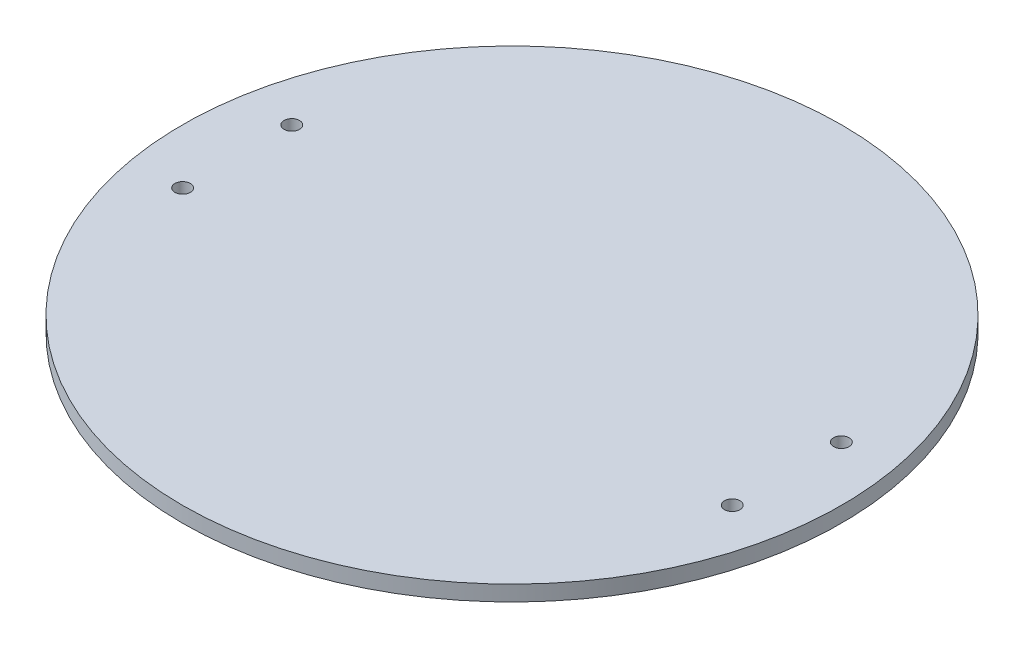
ISO-10303-21;
HEADER;
FILE_DESCRIPTION(('STEP AP214'),'2;1');
FILE_NAME('part.step','',(''),(''),'','','');
FILE_SCHEMA(('AUTOMOTIVE_DESIGN { 1 0 10303 214 1 1 1 1 }'));
ENDSEC;
DATA;
#1=APPLICATION_CONTEXT('core data for automotive mechanical design processes');
#2=APPLICATION_PROTOCOL_DEFINITION('international standard','automotive_design',2000,#1);
#3=PRODUCT_CONTEXT('',#1,'mechanical');
#4=PRODUCT('Part','Part','',(#3));
#5=PRODUCT_RELATED_PRODUCT_CATEGORY('part','',(#4));
#6=PRODUCT_DEFINITION_FORMATION('','',#4);
#7=PRODUCT_DEFINITION_CONTEXT('part definition',#1,'design');
#8=PRODUCT_DEFINITION('design','',#6,#7);
#9=PRODUCT_DEFINITION_SHAPE('','',#8);
#10=(LENGTH_UNIT() NAMED_UNIT(*) SI_UNIT(.MILLI.,.METRE.));
#11=(NAMED_UNIT(*) PLANE_ANGLE_UNIT() SI_UNIT($,.RADIAN.));
#12=(NAMED_UNIT(*) SI_UNIT($,.STERADIAN.) SOLID_ANGLE_UNIT());
#13=UNCERTAINTY_MEASURE_WITH_UNIT(LENGTH_MEASURE(1.E-05),#10,'distance_accuracy_value','');
#14=(GEOMETRIC_REPRESENTATION_CONTEXT(3) GLOBAL_UNCERTAINTY_ASSIGNED_CONTEXT((#13)) GLOBAL_UNIT_ASSIGNED_CONTEXT((#10,
#11,#12)) REPRESENTATION_CONTEXT('',''));
#15=CARTESIAN_POINT('',(0.,0.,0.));
#16=DIRECTION('',(0.,0.,1.));
#17=DIRECTION('',(1.,0.,0.));
#18=AXIS2_PLACEMENT_3D('',#15,#16,#17);
#19=CARTESIAN_POINT('',(0.,2.,0.));
#20=DIRECTION('',(0.,-1.,0.));
#21=DIRECTION('',(0.,0.,-1.));
#22=AXIS2_PLACEMENT_3D('',#19,#20,#21);
#23=CYLINDRICAL_SURFACE('',#22,85.);
#24=CARTESIAN_POINT('',(0.,2.,0.));
#25=DIRECTION('',(0.,1.,0.));
#26=DIRECTION('',(0.,0.,1.));
#27=AXIS2_PLACEMENT_3D('',#24,#25,#26);
#28=CIRCLE('',#27,85.);
#29=CARTESIAN_POINT('',(0.,2.,85.));
#30=VERTEX_POINT('',#29);
#31=EDGE_CURVE('E10',#30,#30,#28,.T.);
#32=ORIENTED_EDGE('',*,*,#31,.F.);
#33=EDGE_LOOP('',(#32));
#34=FACE_BOUND('',#33,.T.);
#35=CARTESIAN_POINT('',(0.,-2.,0.));
#36=DIRECTION('',(0.,1.,0.));
#37=DIRECTION('',(0.,0.,1.));
#38=AXIS2_PLACEMENT_3D('',#35,#36,#37);
#39=CIRCLE('',#38,85.);
#40=CARTESIAN_POINT('',(0.,-2.,85.));
#41=VERTEX_POINT('',#40);
#42=EDGE_CURVE('E39',#41,#41,#39,.T.);
#43=ORIENTED_EDGE('',*,*,#42,.T.);
#44=EDGE_LOOP('',(#43));
#45=FACE_BOUND('',#44,.T.);
#46=ADVANCED_FACE('F36',(#34,#45),#23,.T.);
#47=CARTESIAN_POINT('',(0.,2.,0.));
#48=DIRECTION('',(0.,1.,0.));
#49=DIRECTION('',(0.,0.,1.));
#50=AXIS2_PLACEMENT_3D('',#47,#48,#49);
#51=PLANE('',#50);
#52=CARTESIAN_POINT('',(-70.87,2.,-14.075));
#53=DIRECTION('',(0.,1.,0.));
#54=DIRECTION('',(0.,0.,-1.));
#55=AXIS2_PLACEMENT_3D('',#52,#53,#54);
#56=CIRCLE('',#55,2.);
#57=CARTESIAN_POINT('',(-70.87,2.,-16.075));
#58=VERTEX_POINT('',#57);
#59=EDGE_CURVE('E54',#58,#58,#56,.T.);
#60=ORIENTED_EDGE('',*,*,#59,.F.);
#61=EDGE_LOOP('',(#60));
#62=FACE_BOUND('',#61,.T.);
#63=CARTESIAN_POINT('',(-70.87,2.,14.075));
#64=DIRECTION('',(0.,1.,0.));
#65=DIRECTION('',(0.,0.,1.));
#66=AXIS2_PLACEMENT_3D('',#63,#64,#65);
#67=CIRCLE('',#66,2.);
#68=CARTESIAN_POINT('',(-70.87,2.,16.075));
#69=VERTEX_POINT('',#68);
#70=EDGE_CURVE('E60',#69,#69,#67,.T.);
#71=ORIENTED_EDGE('',*,*,#70,.F.);
#72=EDGE_LOOP('',(#71));
#73=FACE_BOUND('',#72,.T.);
#74=CARTESIAN_POINT('',(70.87,2.,14.075));
#75=DIRECTION('',(0.,1.,0.));
#76=DIRECTION('',(0.,0.,-1.));
#77=AXIS2_PLACEMENT_3D('',#74,#75,#76);
#78=CIRCLE('',#77,2.);
#79=CARTESIAN_POINT('',(70.87,2.,12.075));
#80=VERTEX_POINT('',#79);
#81=EDGE_CURVE('E66',#80,#80,#78,.T.);
#82=ORIENTED_EDGE('',*,*,#81,.F.);
#83=EDGE_LOOP('',(#82));
#84=FACE_BOUND('',#83,.T.);
#85=CARTESIAN_POINT('',(70.87,2.,-14.075));
#86=DIRECTION('',(0.,1.,0.));
#87=DIRECTION('',(0.,0.,1.));
#88=AXIS2_PLACEMENT_3D('',#85,#86,#87);
#89=CIRCLE('',#88,2.);
#90=CARTESIAN_POINT('',(70.87,2.,-12.075));
#91=VERTEX_POINT('',#90);
#92=EDGE_CURVE('E48',#91,#91,#89,.T.);
#93=ORIENTED_EDGE('',*,*,#92,.F.);
#94=EDGE_LOOP('',(#93));
#95=FACE_BOUND('',#94,.T.);
#96=ORIENTED_EDGE('',*,*,#31,.T.);
#97=EDGE_LOOP('',(#96));
#98=FACE_BOUND('',#97,.T.);
#99=ADVANCED_FACE('F83',(#62,#73,#84,#95,#98),#51,.T.);
#100=CARTESIAN_POINT('',(0.,-2.,0.));
#101=DIRECTION('',(0.,1.,0.));
#102=DIRECTION('',(0.,0.,1.));
#103=AXIS2_PLACEMENT_3D('',#100,#101,#102);
#104=PLANE('',#103);
#105=CARTESIAN_POINT('',(-70.87,-2.,-14.075));
#106=DIRECTION('',(0.,1.,0.));
#107=DIRECTION('',(0.,0.,-1.));
#108=AXIS2_PLACEMENT_3D('',#105,#106,#107);
#109=CIRCLE('',#108,2.);
#110=CARTESIAN_POINT('',(-70.87,-2.,-16.075));
#111=VERTEX_POINT('',#110);
#112=EDGE_CURVE('E57',#111,#111,#109,.T.);
#113=ORIENTED_EDGE('',*,*,#112,.T.);
#114=EDGE_LOOP('',(#113));
#115=FACE_BOUND('',#114,.T.);
#116=CARTESIAN_POINT('',(-70.87,-2.,14.075));
#117=DIRECTION('',(0.,1.,0.));
#118=DIRECTION('',(0.,0.,1.));
#119=AXIS2_PLACEMENT_3D('',#116,#117,#118);
#120=CIRCLE('',#119,2.);
#121=CARTESIAN_POINT('',(-70.87,-2.,16.075));
#122=VERTEX_POINT('',#121);
#123=EDGE_CURVE('E63',#122,#122,#120,.T.);
#124=ORIENTED_EDGE('',*,*,#123,.T.);
#125=EDGE_LOOP('',(#124));
#126=FACE_BOUND('',#125,.T.);
#127=CARTESIAN_POINT('',(70.87,-2.,14.075));
#128=DIRECTION('',(0.,1.,0.));
#129=DIRECTION('',(0.,0.,-1.));
#130=AXIS2_PLACEMENT_3D('',#127,#128,#129);
#131=CIRCLE('',#130,2.);
#132=CARTESIAN_POINT('',(70.87,-2.,12.075));
#133=VERTEX_POINT('',#132);
#134=EDGE_CURVE('E51',#133,#133,#131,.T.);
#135=ORIENTED_EDGE('',*,*,#134,.T.);
#136=EDGE_LOOP('',(#135));
#137=FACE_BOUND('',#136,.T.);
#138=CARTESIAN_POINT('',(70.87,-2.,-14.075));
#139=DIRECTION('',(0.,1.,0.));
#140=DIRECTION('',(0.,0.,1.));
#141=AXIS2_PLACEMENT_3D('',#138,#139,#140);
#142=CIRCLE('',#141,2.);
#143=CARTESIAN_POINT('',(70.87,-2.,-12.075));
#144=VERTEX_POINT('',#143);
#145=EDGE_CURVE('E46',#144,#144,#142,.T.);
#146=ORIENTED_EDGE('',*,*,#145,.T.);
#147=EDGE_LOOP('',(#146));
#148=FACE_BOUND('',#147,.T.);
#149=ORIENTED_EDGE('',*,*,#42,.F.);
#150=EDGE_LOOP('',(#149));
#151=FACE_BOUND('',#150,.T.);
#152=ADVANCED_FACE('F72',(#115,#126,#137,#148,#151),#104,.F.);
#153=CARTESIAN_POINT('',(70.87,-2.,-14.075));
#154=DIRECTION('',(0.,1.,0.));
#155=DIRECTION('',(0.,0.,1.));
#156=AXIS2_PLACEMENT_3D('',#153,#154,#155);
#157=CYLINDRICAL_SURFACE('',#156,2.);
#158=ORIENTED_EDGE('',*,*,#145,.F.);
#159=EDGE_LOOP('',(#158));
#160=FACE_BOUND('',#159,.T.);
#161=ORIENTED_EDGE('',*,*,#92,.T.);
#162=EDGE_LOOP('',(#161));
#163=FACE_BOUND('',#162,.T.);
#164=ADVANCED_FACE('F79',(#160,#163),#157,.F.);
#165=CARTESIAN_POINT('',(70.87,-2.,14.075));
#166=DIRECTION('',(0.,1.,0.));
#167=DIRECTION('',(0.,0.,1.));
#168=AXIS2_PLACEMENT_3D('',#165,#166,#167);
#169=CYLINDRICAL_SURFACE('',#168,2.);
#170=ORIENTED_EDGE('',*,*,#134,.F.);
#171=EDGE_LOOP('',(#170));
#172=FACE_BOUND('',#171,.T.);
#173=ORIENTED_EDGE('',*,*,#81,.T.);
#174=EDGE_LOOP('',(#173));
#175=FACE_BOUND('',#174,.T.);
#176=ADVANCED_FACE('F75',(#172,#175),#169,.F.);
#177=CARTESIAN_POINT('',(-70.87,-2.,14.075));
#178=DIRECTION('',(0.,1.,0.));
#179=DIRECTION('',(0.,0.,1.));
#180=AXIS2_PLACEMENT_3D('',#177,#178,#179);
#181=CYLINDRICAL_SURFACE('',#180,2.);
#182=ORIENTED_EDGE('',*,*,#123,.F.);
#183=EDGE_LOOP('',(#182));
#184=FACE_BOUND('',#183,.T.);
#185=ORIENTED_EDGE('',*,*,#70,.T.);
#186=EDGE_LOOP('',(#185));
#187=FACE_BOUND('',#186,.T.);
#188=ADVANCED_FACE('F78',(#184,#187),#181,.F.);
#189=CARTESIAN_POINT('',(-70.87,-2.,-14.075));
#190=DIRECTION('',(0.,1.,0.));
#191=DIRECTION('',(0.,0.,1.));
#192=AXIS2_PLACEMENT_3D('',#189,#190,#191);
#193=CYLINDRICAL_SURFACE('',#192,2.);
#194=ORIENTED_EDGE('',*,*,#112,.F.);
#195=EDGE_LOOP('',(#194));
#196=FACE_BOUND('',#195,.T.);
#197=ORIENTED_EDGE('',*,*,#59,.T.);
#198=EDGE_LOOP('',(#197));
#199=FACE_BOUND('',#198,.T.);
#200=ADVANCED_FACE('F133',(#196,#199),#193,.F.);
#201=CLOSED_SHELL('',(#46,#99,#152,#164,#176,#188,#200));
#202=MANIFOLD_SOLID_BREP('B2',#201);
#203=ADVANCED_BREP_SHAPE_REPRESENTATION('',(#18,#202),#14);
#204=SHAPE_DEFINITION_REPRESENTATION(#9,#203);
ENDSEC;
END-ISO-10303-21;
